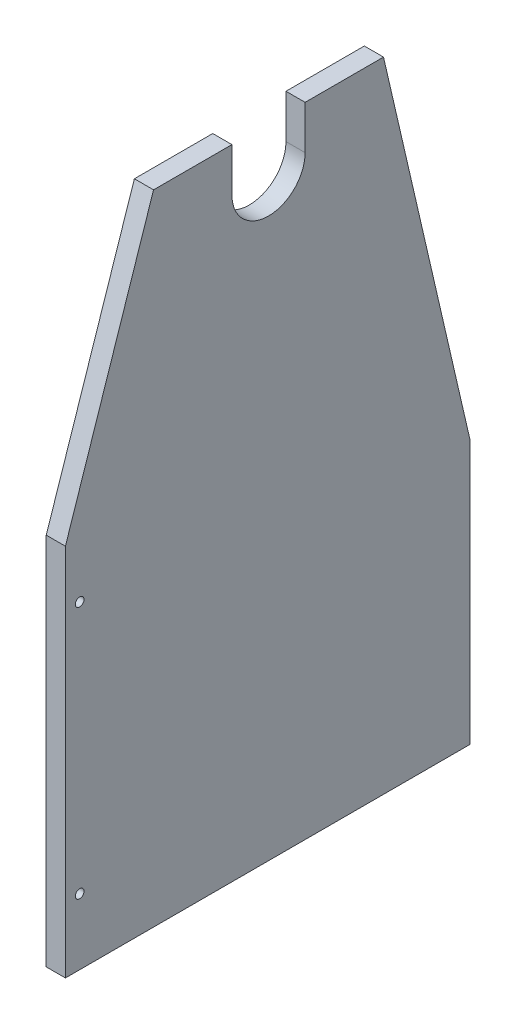
ISO-10303-21;
HEADER;
FILE_DESCRIPTION(('STEP AP214'),'2;1');
FILE_NAME('part.step','',(''),(''),'','','');
FILE_SCHEMA(('AUTOMOTIVE_DESIGN { 1 0 10303 214 1 1 1 1 }'));
ENDSEC;
DATA;
#1=APPLICATION_CONTEXT('core data for automotive mechanical design processes');
#2=APPLICATION_PROTOCOL_DEFINITION('international standard','automotive_design',2000,#1);
#3=PRODUCT_CONTEXT('',#1,'mechanical');
#4=PRODUCT('Part','Part','',(#3));
#5=PRODUCT_RELATED_PRODUCT_CATEGORY('part','',(#4));
#6=PRODUCT_DEFINITION_FORMATION('','',#4);
#7=PRODUCT_DEFINITION_CONTEXT('part definition',#1,'design');
#8=PRODUCT_DEFINITION('design','',#6,#7);
#9=PRODUCT_DEFINITION_SHAPE('','',#8);
#10=(LENGTH_UNIT() NAMED_UNIT(*) SI_UNIT(.MILLI.,.METRE.));
#11=(NAMED_UNIT(*) PLANE_ANGLE_UNIT() SI_UNIT($,.RADIAN.));
#12=(NAMED_UNIT(*) SI_UNIT($,.STERADIAN.) SOLID_ANGLE_UNIT());
#13=UNCERTAINTY_MEASURE_WITH_UNIT(LENGTH_MEASURE(1.E-05),#10,'distance_accuracy_value','');
#14=(GEOMETRIC_REPRESENTATION_CONTEXT(3) GLOBAL_UNCERTAINTY_ASSIGNED_CONTEXT((#13)) GLOBAL_UNIT_ASSIGNED_CONTEXT((#10,
#11,#12)) REPRESENTATION_CONTEXT('',''));
#15=CARTESIAN_POINT('',(0.,0.,0.));
#16=DIRECTION('',(0.,0.,1.));
#17=DIRECTION('',(1.,0.,0.));
#18=AXIS2_PLACEMENT_3D('',#15,#16,#17);
#19=CARTESIAN_POINT('',(17.4625,581.598745126243,-80.2642673699791));
#20=DIRECTION('',(0.,-1.,0.));
#21=DIRECTION('',(0.,0.,-1.));
#22=AXIS2_PLACEMENT_3D('',#19,#20,#21);
#23=PLANE('',#22);
#24=DIRECTION('',(1.,0.,0.));
#25=VECTOR('',#24,1.);
#26=CARTESIAN_POINT('',(-98.8848130402237,581.598745126243,-151.662555820192));
#27=LINE('',#26,#25);
#28=CARTESIAN_POINT('',(0.,581.598745126243,-151.662555820192));
#29=VERTEX_POINT('',#28);
#30=CARTESIAN_POINT('',(17.4625,581.598745126243,-151.662555820192));
#31=VERTEX_POINT('',#30);
#32=EDGE_CURVE('E199',#29,#31,#27,.T.);
#33=ORIENTED_EDGE('',*,*,#32,.F.);
#34=DIRECTION('',(0.,0.,1.));
#35=VECTOR('',#34,1.);
#36=CARTESIAN_POINT('',(0.,581.598745126243,-80.2642673699791));
#37=LINE('',#36,#35);
#38=CARTESIAN_POINT('',(0.,581.598745126243,-80.2642673699791));
#39=VERTEX_POINT('',#38);
#40=EDGE_CURVE('E147',#29,#39,#37,.T.);
#41=ORIENTED_EDGE('',*,*,#40,.T.);
#42=DIRECTION('',(-1.,0.,0.));
#43=VECTOR('',#42,1.);
#44=CARTESIAN_POINT('',(17.4625,581.598745126243,-80.2642673699791));
#45=LINE('',#44,#43);
#46=CARTESIAN_POINT('',(17.4625,581.598745126243,-80.2642673699791));
#47=VERTEX_POINT('',#46);
#48=EDGE_CURVE('E128',#47,#39,#45,.T.);
#49=ORIENTED_EDGE('',*,*,#48,.F.);
#50=DIRECTION('',(0.,0.,1.));
#51=VECTOR('',#50,1.);
#52=CARTESIAN_POINT('',(17.4625,581.598745126243,-80.2642673699791));
#53=LINE('',#52,#51);
#54=EDGE_CURVE('E118',#31,#47,#53,.T.);
#55=ORIENTED_EDGE('',*,*,#54,.F.);
#56=EDGE_LOOP('',(#33,#41,#49,#55));
#57=FACE_BOUND('',#56,.T.);
#58=ADVANCED_FACE('F36',(#57),#23,.F.);
#59=CARTESIAN_POINT('',(17.4625,340.614,0.));
#60=DIRECTION('',(0.,0.,-1.));
#61=DIRECTION('',(0.,1.,0.));
#62=AXIS2_PLACEMENT_3D('',#59,#60,#61);
#63=PLANE('',#62);
#64=DIRECTION('',(0.,-1.,0.));
#65=VECTOR('',#64,1.);
#66=CARTESIAN_POINT('',(0.,340.614,0.));
#67=LINE('',#66,#65);
#68=CARTESIAN_POINT('',(0.,340.614,0.));
#69=VERTEX_POINT('',#68);
#70=CARTESIAN_POINT('',(0.,0.,0.));
#71=VERTEX_POINT('',#70);
#72=EDGE_CURVE('E143',#69,#71,#67,.T.);
#73=ORIENTED_EDGE('',*,*,#72,.T.);
#74=DIRECTION('',(-1.,0.,0.));
#75=VECTOR('',#74,1.);
#76=CARTESIAN_POINT('',(17.4625,0.,0.));
#77=LINE('',#76,#75);
#78=CARTESIAN_POINT('',(17.4625,0.,0.));
#79=VERTEX_POINT('',#78);
#80=EDGE_CURVE('E11',#79,#71,#77,.T.);
#81=ORIENTED_EDGE('',*,*,#80,.F.);
#82=DIRECTION('',(0.,-1.,0.));
#83=VECTOR('',#82,1.);
#84=CARTESIAN_POINT('',(17.4625,340.614,0.));
#85=LINE('',#84,#83);
#86=CARTESIAN_POINT('',(17.4625,340.614,0.));
#87=VERTEX_POINT('',#86);
#88=EDGE_CURVE('E152',#87,#79,#85,.T.);
#89=ORIENTED_EDGE('',*,*,#88,.F.);
#90=DIRECTION('',(-1.,0.,0.));
#91=VECTOR('',#90,1.);
#92=CARTESIAN_POINT('',(17.4625,340.614,0.));
#93=LINE('',#92,#91);
#94=EDGE_CURVE('E140',#87,#69,#93,.T.);
#95=ORIENTED_EDGE('',*,*,#94,.T.);
#96=EDGE_LOOP('',(#73,#81,#89,#95));
#97=FACE_BOUND('',#96,.T.);
#98=ADVANCED_FACE('F37',(#97),#63,.F.);
#99=CARTESIAN_POINT('',(17.4625,0.,0.));
#100=DIRECTION('',(0.,1.,0.));
#101=DIRECTION('',(0.,0.,1.));
#102=AXIS2_PLACEMENT_3D('',#99,#100,#101);
#103=PLANE('',#102);
#104=DIRECTION('',(0.,0.,-1.));
#105=VECTOR('',#104,1.);
#106=CARTESIAN_POINT('',(0.,0.,0.));
#107=LINE('',#106,#105);
#108=CARTESIAN_POINT('',(0.,0.,-368.3));
#109=VERTEX_POINT('',#108);
#110=EDGE_CURVE('E145',#71,#109,#107,.T.);
#111=ORIENTED_EDGE('',*,*,#110,.T.);
#112=DIRECTION('',(-1.,0.,0.));
#113=VECTOR('',#112,1.);
#114=CARTESIAN_POINT('',(17.4625,0.,-368.3));
#115=LINE('',#114,#113);
#116=CARTESIAN_POINT('',(17.4625,0.,-368.3));
#117=VERTEX_POINT('',#116);
#118=EDGE_CURVE('E46',#117,#109,#115,.T.);
#119=ORIENTED_EDGE('',*,*,#118,.F.);
#120=DIRECTION('',(0.,0.,-1.));
#121=VECTOR('',#120,1.);
#122=CARTESIAN_POINT('',(17.4625,0.,0.));
#123=LINE('',#122,#121);
#124=EDGE_CURVE('E100',#79,#117,#123,.T.);
#125=ORIENTED_EDGE('',*,*,#124,.F.);
#126=ORIENTED_EDGE('',*,*,#80,.T.);
#127=EDGE_LOOP('',(#111,#119,#125,#126));
#128=FACE_BOUND('',#127,.T.);
#129=ADVANCED_FACE('F207',(#128),#103,.F.);
#130=CARTESIAN_POINT('',(17.4625,0.,-368.3));
#131=DIRECTION('',(0.,0.,1.));
#132=DIRECTION('',(1.,0.,0.));
#133=AXIS2_PLACEMENT_3D('',#130,#131,#132);
#134=PLANE('',#133);
#135=DIRECTION('',(0.,1.,0.));
#136=VECTOR('',#135,1.);
#137=CARTESIAN_POINT('',(0.,0.,-368.3));
#138=LINE('',#137,#136);
#139=CARTESIAN_POINT('',(0.,241.3,-368.3));
#140=VERTEX_POINT('',#139);
#141=EDGE_CURVE('E150',#109,#140,#138,.T.);
#142=ORIENTED_EDGE('',*,*,#141,.T.);
#143=DIRECTION('',(-1.,0.,0.));
#144=VECTOR('',#143,1.);
#145=CARTESIAN_POINT('',(17.4625,241.3,-368.3));
#146=LINE('',#145,#144);
#147=CARTESIAN_POINT('',(17.4625,241.3,-368.3));
#148=VERTEX_POINT('',#147);
#149=EDGE_CURVE('E129',#148,#140,#146,.T.);
#150=ORIENTED_EDGE('',*,*,#149,.F.);
#151=DIRECTION('',(0.,1.,0.));
#152=VECTOR('',#151,1.);
#153=CARTESIAN_POINT('',(17.4625,0.,-368.3));
#154=LINE('',#153,#152);
#155=EDGE_CURVE('E113',#117,#148,#154,.T.);
#156=ORIENTED_EDGE('',*,*,#155,.F.);
#157=ORIENTED_EDGE('',*,*,#118,.T.);
#158=EDGE_LOOP('',(#142,#150,#156,#157));
#159=FACE_BOUND('',#158,.T.);
#160=ADVANCED_FACE('F159',(#159),#134,.F.);
#161=CARTESIAN_POINT('',(17.4625,241.3,-368.3));
#162=DIRECTION('',(0.,-0.224951054343865,0.974370064785235));
#163=DIRECTION('',(0.,-0.974370064785235,-0.224951054343865));
#164=AXIS2_PLACEMENT_3D('',#161,#162,#163);
#165=PLANE('',#164);
#166=DIRECTION('',(0.,0.974370064785235,0.224951054343865));
#167=VECTOR('',#166,1.);
#168=CARTESIAN_POINT('',(0.,241.3,-368.3));
#169=LINE('',#168,#167);
#170=CARTESIAN_POINT('',(0.,581.598745126243,-289.735844270405));
#171=VERTEX_POINT('',#170);
#172=EDGE_CURVE('E121',#140,#171,#169,.T.);
#173=ORIENTED_EDGE('',*,*,#172,.T.);
#174=DIRECTION('',(-1.,0.,0.));
#175=VECTOR('',#174,1.);
#176=CARTESIAN_POINT('',(17.4625,581.598745126243,-289.735844270405));
#177=LINE('',#176,#175);
#178=CARTESIAN_POINT('',(17.4625,581.598745126243,-289.735844270405));
#179=VERTEX_POINT('',#178);
#180=EDGE_CURVE('E124',#179,#171,#177,.T.);
#181=ORIENTED_EDGE('',*,*,#180,.F.);
#182=DIRECTION('',(0.,0.974370064785235,0.224951054343865));
#183=VECTOR('',#182,1.);
#184=CARTESIAN_POINT('',(17.4625,241.3,-368.3));
#185=LINE('',#184,#183);
#186=EDGE_CURVE('E110',#148,#179,#185,.T.);
#187=ORIENTED_EDGE('',*,*,#186,.F.);
#188=ORIENTED_EDGE('',*,*,#149,.T.);
#189=EDGE_LOOP('',(#173,#181,#187,#188));
#190=FACE_BOUND('',#189,.T.);
#191=ADVANCED_FACE('F122',(#190),#165,.F.);
#192=CARTESIAN_POINT('',(0.,581.598745126243,-218.337555820192));
#193=VERTEX_POINT('',#192);
#194=EDGE_CURVE('E151',#171,#193,#37,.T.);
#195=ORIENTED_EDGE('',*,*,#194,.T.);
#196=DIRECTION('',(1.,0.,0.));
#197=VECTOR('',#196,1.);
#198=CARTESIAN_POINT('',(-98.8848130402237,581.598745126243,-218.337555820192));
#199=LINE('',#198,#197);
#200=CARTESIAN_POINT('',(17.4625,581.598745126243,-218.337555820192));
#201=VERTEX_POINT('',#200);
#202=EDGE_CURVE('E132',#193,#201,#199,.T.);
#203=ORIENTED_EDGE('',*,*,#202,.T.);
#204=EDGE_CURVE('E114',#179,#201,#53,.T.);
#205=ORIENTED_EDGE('',*,*,#204,.F.);
#206=ORIENTED_EDGE('',*,*,#180,.T.);
#207=EDGE_LOOP('',(#195,#203,#205,#206));
#208=FACE_BOUND('',#207,.T.);
#209=ADVANCED_FACE('F135',(#208),#23,.F.);
#210=CARTESIAN_POINT('',(17.4625,581.598745126243,-80.2642673699791));
#211=DIRECTION('',(0.,-0.316001052637713,-0.948758839079699));
#212=DIRECTION('',(0.,0.948758839079699,-0.316001052637713));
#213=AXIS2_PLACEMENT_3D('',#210,#211,#212);
#214=PLANE('',#213);
#215=DIRECTION('',(0.,-0.948758839079698,0.316001052637713));
#216=VECTOR('',#215,1.);
#217=CARTESIAN_POINT('',(0.,581.598745126243,-80.2642673699791));
#218=LINE('',#217,#216);
#219=EDGE_CURVE('E90',#39,#69,#218,.T.);
#220=ORIENTED_EDGE('',*,*,#219,.T.);
#221=ORIENTED_EDGE('',*,*,#94,.F.);
#222=DIRECTION('',(0.,-0.948758839079698,0.316001052637713));
#223=VECTOR('',#222,1.);
#224=CARTESIAN_POINT('',(17.4625,581.598745126243,-80.2642673699791));
#225=LINE('',#224,#223);
#226=EDGE_CURVE('E61',#47,#87,#225,.T.);
#227=ORIENTED_EDGE('',*,*,#226,.F.);
#228=ORIENTED_EDGE('',*,*,#48,.T.);
#229=EDGE_LOOP('',(#220,#221,#227,#228));
#230=FACE_BOUND('',#229,.T.);
#231=ADVANCED_FACE('F229',(#230),#214,.F.);
#232=CARTESIAN_POINT('',(17.4625,0.,0.));
#233=DIRECTION('',(1.,0.,0.));
#234=DIRECTION('',(0.,0.,-1.));
#235=AXIS2_PLACEMENT_3D('',#232,#233,#234);
#236=PLANE('',#235);
#237=CARTESIAN_POINT('',(17.4625,60.,-13.));
#238=DIRECTION('',(1.,0.,0.));
#239=DIRECTION('',(0.,0.,-1.));
#240=AXIS2_PLACEMENT_3D('',#237,#238,#239);
#241=CIRCLE('',#240,3.96875);
#242=CARTESIAN_POINT('',(17.4625,60.,-9.03125));
#243=VERTEX_POINT('',#242);
#244=EDGE_CURVE('E195',#243,#243,#241,.F.);
#245=ORIENTED_EDGE('',*,*,#244,.T.);
#246=EDGE_LOOP('',(#245));
#247=FACE_BOUND('',#246,.T.);
#248=CARTESIAN_POINT('',(17.4625,290.1875,-13.));
#249=DIRECTION('',(1.,0.,0.));
#250=DIRECTION('',(0.,0.,-1.));
#251=AXIS2_PLACEMENT_3D('',#248,#249,#250);
#252=CIRCLE('',#251,3.96875000000002);
#253=CARTESIAN_POINT('',(17.4625,290.1875,-9.03124999999998));
#254=VERTEX_POINT('',#253);
#255=EDGE_CURVE('E322',#254,#254,#252,.F.);
#256=ORIENTED_EDGE('',*,*,#255,.T.);
#257=EDGE_LOOP('',(#256));
#258=FACE_BOUND('',#257,.T.);
#259=DIRECTION('',(0.,1.,0.));
#260=VECTOR('',#259,1.);
#261=CARTESIAN_POINT('',(17.4625,0.,-218.337555820192));
#262=LINE('',#261,#260);
#263=CARTESIAN_POINT('',(17.4625,541.911245126243,-218.337555820192));
#264=VERTEX_POINT('',#263);
#265=EDGE_CURVE('E185',#264,#201,#262,.T.);
#266=ORIENTED_EDGE('',*,*,#265,.F.);
#267=CARTESIAN_POINT('',(17.4625,541.911245126243,-185.000055820192));
#268=DIRECTION('',(1.,0.,0.));
#269=DIRECTION('',(0.,0.,-1.));
#270=AXIS2_PLACEMENT_3D('',#267,#268,#269);
#271=CIRCLE('',#270,33.3375);
#272=CARTESIAN_POINT('',(17.4625,541.911245126243,-151.662555820192));
#273=VERTEX_POINT('',#272);
#274=EDGE_CURVE('E189',#273,#264,#271,.T.);
#275=ORIENTED_EDGE('',*,*,#274,.F.);
#276=DIRECTION('',(0.,1.,0.));
#277=VECTOR('',#276,1.);
#278=CARTESIAN_POINT('',(17.4625,0.,-151.662555820192));
#279=LINE('',#278,#277);
#280=EDGE_CURVE('E181',#273,#31,#279,.T.);
#281=ORIENTED_EDGE('',*,*,#280,.T.);
#282=ORIENTED_EDGE('',*,*,#54,.T.);
#283=ORIENTED_EDGE('',*,*,#226,.T.);
#284=ORIENTED_EDGE('',*,*,#88,.T.);
#285=ORIENTED_EDGE('',*,*,#124,.T.);
#286=ORIENTED_EDGE('',*,*,#155,.T.);
#287=ORIENTED_EDGE('',*,*,#186,.T.);
#288=ORIENTED_EDGE('',*,*,#204,.T.);
#289=EDGE_LOOP('',(#266,#275,#281,#282,#283,#284,#285,#286,#287,#288));
#290=FACE_BOUND('',#289,.T.);
#291=ADVANCED_FACE('F109',(#247,#258,#290),#236,.T.);
#292=CARTESIAN_POINT('',(0.,0.,0.));
#293=DIRECTION('',(1.,0.,0.));
#294=DIRECTION('',(0.,0.,-1.));
#295=AXIS2_PLACEMENT_3D('',#292,#293,#294);
#296=PLANE('',#295);
#297=CARTESIAN_POINT('',(0.,60.,-13.));
#298=DIRECTION('',(-1.,0.,0.));
#299=DIRECTION('',(0.,0.,1.));
#300=AXIS2_PLACEMENT_3D('',#297,#298,#299);
#301=CIRCLE('',#300,3.96875);
#302=CARTESIAN_POINT('',(0.,60.,-9.03125));
#303=VERTEX_POINT('',#302);
#304=EDGE_CURVE('E320',#303,#303,#301,.T.);
#305=ORIENTED_EDGE('',*,*,#304,.F.);
#306=EDGE_LOOP('',(#305));
#307=FACE_BOUND('',#306,.T.);
#308=CARTESIAN_POINT('',(0.,290.1875,-13.));
#309=DIRECTION('',(-1.,0.,0.));
#310=DIRECTION('',(0.,0.,1.));
#311=AXIS2_PLACEMENT_3D('',#308,#309,#310);
#312=CIRCLE('',#311,3.96875000000002);
#313=CARTESIAN_POINT('',(0.,290.1875,-9.03124999999998));
#314=VERTEX_POINT('',#313);
#315=EDGE_CURVE('E321',#314,#314,#312,.T.);
#316=ORIENTED_EDGE('',*,*,#315,.F.);
#317=EDGE_LOOP('',(#316));
#318=FACE_BOUND('',#317,.T.);
#319=ORIENTED_EDGE('',*,*,#40,.F.);
#320=DIRECTION('',(0.,-1.,0.));
#321=VECTOR('',#320,1.);
#322=CARTESIAN_POINT('',(0.,0.,-151.662555820192));
#323=LINE('',#322,#321);
#324=CARTESIAN_POINT('',(0.,541.911245126243,-151.662555820192));
#325=VERTEX_POINT('',#324);
#326=EDGE_CURVE('E200',#29,#325,#323,.T.);
#327=ORIENTED_EDGE('',*,*,#326,.T.);
#328=CARTESIAN_POINT('',(0.,541.911245126243,-185.000055820192));
#329=DIRECTION('',(1.,0.,0.));
#330=DIRECTION('',(0.,0.,-1.));
#331=AXIS2_PLACEMENT_3D('',#328,#329,#330);
#332=CIRCLE('',#331,33.3375);
#333=CARTESIAN_POINT('',(0.,541.911245126243,-218.337555820192));
#334=VERTEX_POINT('',#333);
#335=EDGE_CURVE('E204',#334,#325,#332,.F.);
#336=ORIENTED_EDGE('',*,*,#335,.F.);
#337=DIRECTION('',(0.,-1.,0.));
#338=VECTOR('',#337,1.);
#339=CARTESIAN_POINT('',(0.,0.,-218.337555820192));
#340=LINE('',#339,#338);
#341=EDGE_CURVE('E144',#193,#334,#340,.T.);
#342=ORIENTED_EDGE('',*,*,#341,.F.);
#343=ORIENTED_EDGE('',*,*,#194,.F.);
#344=ORIENTED_EDGE('',*,*,#172,.F.);
#345=ORIENTED_EDGE('',*,*,#141,.F.);
#346=ORIENTED_EDGE('',*,*,#110,.F.);
#347=ORIENTED_EDGE('',*,*,#72,.F.);
#348=ORIENTED_EDGE('',*,*,#219,.F.);
#349=EDGE_LOOP('',(#319,#327,#336,#342,#343,#344,#345,#346,#347,#348));
#350=FACE_BOUND('',#349,.T.);
#351=ADVANCED_FACE('F162',(#307,#318,#350),#296,.F.);
#352=CARTESIAN_POINT('',(-98.8848130402237,541.911245126243,-185.000055820192));
#353=DIRECTION('',(1.,0.,0.));
#354=DIRECTION('',(0.,0.,-1.));
#355=AXIS2_PLACEMENT_3D('',#352,#353,#354);
#356=CYLINDRICAL_SURFACE('',#355,33.3375);
#357=ORIENTED_EDGE('',*,*,#335,.T.);
#358=DIRECTION('',(1.,0.,0.));
#359=VECTOR('',#358,1.);
#360=CARTESIAN_POINT('',(-98.8848130402237,541.911245126243,-151.662555820192));
#361=LINE('',#360,#359);
#362=EDGE_CURVE('E188',#325,#273,#361,.T.);
#363=ORIENTED_EDGE('',*,*,#362,.T.);
#364=ORIENTED_EDGE('',*,*,#274,.T.);
#365=DIRECTION('',(1.,0.,0.));
#366=VECTOR('',#365,1.);
#367=CARTESIAN_POINT('',(-98.8848130402237,541.911245126243,-218.337555820192));
#368=LINE('',#367,#366);
#369=EDGE_CURVE('E52',#334,#264,#368,.T.);
#370=ORIENTED_EDGE('',*,*,#369,.F.);
#371=EDGE_LOOP('',(#357,#363,#364,#370));
#372=FACE_BOUND('',#371,.T.);
#373=ADVANCED_FACE('F186',(#372),#356,.F.);
#374=CARTESIAN_POINT('',(-98.8848130402237,0.,-151.662555820192));
#375=DIRECTION('',(0.,0.,-1.));
#376=DIRECTION('',(-1.,0.,0.));
#377=AXIS2_PLACEMENT_3D('',#374,#375,#376);
#378=PLANE('',#377);
#379=ORIENTED_EDGE('',*,*,#32,.T.);
#380=ORIENTED_EDGE('',*,*,#280,.F.);
#381=ORIENTED_EDGE('',*,*,#362,.F.);
#382=ORIENTED_EDGE('',*,*,#326,.F.);
#383=EDGE_LOOP('',(#379,#380,#381,#382));
#384=FACE_BOUND('',#383,.T.);
#385=ADVANCED_FACE('F277',(#384),#378,.T.);
#386=CARTESIAN_POINT('',(-98.8848130402237,0.,-218.337555820192));
#387=DIRECTION('',(0.,0.,-1.));
#388=DIRECTION('',(-1.,0.,0.));
#389=AXIS2_PLACEMENT_3D('',#386,#387,#388);
#390=PLANE('',#389);
#391=ORIENTED_EDGE('',*,*,#341,.T.);
#392=ORIENTED_EDGE('',*,*,#369,.T.);
#393=ORIENTED_EDGE('',*,*,#265,.T.);
#394=ORIENTED_EDGE('',*,*,#202,.F.);
#395=EDGE_LOOP('',(#391,#392,#393,#394));
#396=FACE_BOUND('',#395,.T.);
#397=ADVANCED_FACE('F182',(#396),#390,.F.);
#398=CARTESIAN_POINT('',(28.6878201513365,290.1875,-13.));
#399=DIRECTION('',(-1.,0.,0.));
#400=DIRECTION('',(0.,0.,1.));
#401=AXIS2_PLACEMENT_3D('',#398,#399,#400);
#402=CYLINDRICAL_SURFACE('',#401,3.96875000000002);
#403=CARTESIAN_POINT('',(0.,290.1875,-9.03124999999998));
#404=CARTESIAN_POINT('',(0.181901041666671,290.1875,-9.03124999999998));
#405=CARTESIAN_POINT('',(0.363802083333338,290.1875,-9.03124999999998));
#406=CARTESIAN_POINT('',(0.727604166666671,290.1875,-9.03124999999998));
#407=CARTESIAN_POINT('',(0.909505208333337,290.1875,-9.03124999999998));
#408=CARTESIAN_POINT('',(1.27330729166667,290.1875,-9.03124999999998));
#409=CARTESIAN_POINT('',(1.45520833333334,290.1875,-9.03124999999998));
#410=CARTESIAN_POINT('',(1.81901041666667,290.1875,-9.03124999999998));
#411=CARTESIAN_POINT('',(2.00091145833334,290.1875,-9.03124999999998));
#412=CARTESIAN_POINT('',(2.36471354166667,290.1875,-9.03124999999998));
#413=CARTESIAN_POINT('',(2.54661458333334,290.1875,-9.03124999999998));
#414=CARTESIAN_POINT('',(2.91041666666667,290.1875,-9.03124999999998));
#415=CARTESIAN_POINT('',(3.09231770833334,290.1875,-9.03124999999998));
#416=CARTESIAN_POINT('',(3.45611979166667,290.1875,-9.03124999999998));
#417=CARTESIAN_POINT('',(3.63802083333334,290.1875,-9.03124999999998));
#418=CARTESIAN_POINT('',(4.00182291666667,290.1875,-9.03124999999998));
#419=CARTESIAN_POINT('',(4.18372395833334,290.1875,-9.03124999999998));
#420=CARTESIAN_POINT('',(4.54752604166667,290.1875,-9.03124999999998));
#421=CARTESIAN_POINT('',(4.72942708333334,290.1875,-9.03124999999998));
#422=CARTESIAN_POINT('',(5.09322916666667,290.1875,-9.03124999999998));
#423=CARTESIAN_POINT('',(5.27513020833334,290.1875,-9.03124999999998));
#424=CARTESIAN_POINT('',(5.63893229166667,290.1875,-9.03124999999998));
#425=CARTESIAN_POINT('',(5.82083333333333,290.1875,-9.03124999999998));
#426=CARTESIAN_POINT('',(6.18463541666667,290.1875,-9.03124999999998));
#427=CARTESIAN_POINT('',(6.36653645833333,290.1875,-9.03124999999998));
#428=CARTESIAN_POINT('',(6.73033854166667,290.1875,-9.03124999999998));
#429=CARTESIAN_POINT('',(6.91223958333333,290.1875,-9.03124999999998));
#430=CARTESIAN_POINT('',(7.27604166666667,290.1875,-9.03124999999998));
#431=CARTESIAN_POINT('',(7.45794270833334,290.1875,-9.03124999999998));
#432=CARTESIAN_POINT('',(7.82174479166667,290.1875,-9.03124999999998));
#433=CARTESIAN_POINT('',(8.00364583333334,290.1875,-9.03124999999998));
#434=CARTESIAN_POINT('',(8.36744791666667,290.1875,-9.03124999999998));
#435=CARTESIAN_POINT('',(8.54934895833333,290.1875,-9.03124999999998));
#436=CARTESIAN_POINT('',(8.91315104166667,290.1875,-9.03124999999998));
#437=CARTESIAN_POINT('',(9.09505208333333,290.1875,-9.03124999999998));
#438=CARTESIAN_POINT('',(9.45885416666667,290.1875,-9.03124999999998));
#439=CARTESIAN_POINT('',(9.64075520833333,290.1875,-9.03124999999998));
#440=CARTESIAN_POINT('',(10.0045572916667,290.1875,-9.03124999999998));
#441=CARTESIAN_POINT('',(10.1864583333333,290.1875,-9.03124999999998));
#442=CARTESIAN_POINT('',(10.5502604166667,290.1875,-9.03124999999998));
#443=CARTESIAN_POINT('',(10.7321614583333,290.1875,-9.03124999999998));
#444=CARTESIAN_POINT('',(11.0959635416667,290.1875,-9.03124999999998));
#445=CARTESIAN_POINT('',(11.2778645833333,290.1875,-9.03124999999998));
#446=CARTESIAN_POINT('',(11.6416666666667,290.1875,-9.03124999999998));
#447=CARTESIAN_POINT('',(11.8235677083333,290.1875,-9.03124999999998));
#448=CARTESIAN_POINT('',(12.1873697916667,290.1875,-9.03124999999998));
#449=CARTESIAN_POINT('',(12.3692708333333,290.1875,-9.03124999999998));
#450=CARTESIAN_POINT('',(12.7330729166667,290.1875,-9.03124999999998));
#451=CARTESIAN_POINT('',(12.9149739583333,290.1875,-9.03124999999998));
#452=CARTESIAN_POINT('',(13.2787760416667,290.1875,-9.03124999999998));
#453=CARTESIAN_POINT('',(13.4606770833333,290.1875,-9.03124999999998));
#454=CARTESIAN_POINT('',(13.8244791666667,290.1875,-9.03124999999998));
#455=CARTESIAN_POINT('',(14.0063802083333,290.1875,-9.03124999999998));
#456=CARTESIAN_POINT('',(14.3701822916667,290.1875,-9.03124999999998));
#457=CARTESIAN_POINT('',(14.5520833333333,290.1875,-9.03124999999998));
#458=CARTESIAN_POINT('',(14.9158854166667,290.1875,-9.03124999999998));
#459=CARTESIAN_POINT('',(15.0977864583333,290.1875,-9.03124999999998));
#460=CARTESIAN_POINT('',(15.4615885416667,290.1875,-9.03124999999998));
#461=CARTESIAN_POINT('',(15.6434895833333,290.1875,-9.03124999999998));
#462=CARTESIAN_POINT('',(16.0072916666667,290.1875,-9.03124999999998));
#463=CARTESIAN_POINT('',(16.1891927083333,290.1875,-9.03124999999998));
#464=CARTESIAN_POINT('',(16.5529947916667,290.1875,-9.03124999999998));
#465=CARTESIAN_POINT('',(16.7348958333333,290.1875,-9.03124999999998));
#466=CARTESIAN_POINT('',(17.0986979166667,290.1875,-9.03124999999998));
#467=CARTESIAN_POINT('',(17.2805989583333,290.1875,-9.03124999999998));
#468=CARTESIAN_POINT('',(17.4625,290.1875,-9.03124999999998));
#469=B_SPLINE_CURVE_WITH_KNOTS('',3,(#403,#404,#405,#406,#407,#408,#409,#410,#411,#412,#413,
#414,#415,#416,#417,#418,#419,#420,#421,#422,#423,#424,#425,#426,#427,#428,#429,#430,#431,#432,
#433,#434,#435,#436,#437,#438,#439,#440,#441,#442,#443,#444,#445,#446,#447,#448,#449,#450,#451,
#452,#453,#454,#455,#456,#457,#458,#459,#460,#461,#462,#463,#464,#465,#466,#467,#468),
.UNSPECIFIED.,.F.,.F.,(4,2,2,2,2,2,2,2,2,2,2,2,2,2,2,2,2,2,2,2,2,2,2,2,2,2,2,2,2,2,2,2,4),(0.,
0.545703125000002,1.09140625,1.637109375,2.1828125,2.728515625,3.27421875,3.819921875,4.365625,
4.911328125,5.45703125,6.002734375,6.5484375,7.094140625,7.63984375,8.185546875,8.73125,
9.276953125,9.82265625,10.368359375,10.9140625,11.459765625,12.00546875,12.551171875,13.096875,
13.642578125,14.18828125,14.733984375,15.2796875,15.825390625,16.37109375,16.916796875,17.4625),.UNSPECIFIED.);
#470=EDGE_CURVE('BSEAM291',#314,#254,#469,.T.);
#471=ORIENTED_EDGE('',*,*,#315,.T.);
#472=ORIENTED_EDGE('',*,*,#255,.F.);
#473=ORIENTED_EDGE('',*,*,#470,.T.);
#474=ORIENTED_EDGE('',*,*,#470,.F.);
#475=EDGE_LOOP('',(#471,#473,#472,#474));
#476=FACE_BOUND('',#475,.T.);
#477=ADVANCED_FACE('F291',(#476),#402,.F.);
#478=CARTESIAN_POINT('',(28.6878201513365,60.,-13.));
#479=DIRECTION('',(-1.,0.,0.));
#480=DIRECTION('',(0.,0.,1.));
#481=AXIS2_PLACEMENT_3D('',#478,#479,#480);
#482=CYLINDRICAL_SURFACE('',#481,3.96875);
#483=CARTESIAN_POINT('',(0.,60.,-9.03125));
#484=CARTESIAN_POINT('',(0.181901041666671,60.,-9.03125));
#485=CARTESIAN_POINT('',(0.363802083333338,60.,-9.03125));
#486=CARTESIAN_POINT('',(0.727604166666671,60.,-9.03125));
#487=CARTESIAN_POINT('',(0.909505208333337,60.,-9.03125));
#488=CARTESIAN_POINT('',(1.27330729166667,60.,-9.03125));
#489=CARTESIAN_POINT('',(1.45520833333334,60.,-9.03125));
#490=CARTESIAN_POINT('',(1.81901041666667,60.,-9.03125));
#491=CARTESIAN_POINT('',(2.00091145833334,60.,-9.03125));
#492=CARTESIAN_POINT('',(2.36471354166667,60.,-9.03125));
#493=CARTESIAN_POINT('',(2.54661458333334,60.,-9.03125));
#494=CARTESIAN_POINT('',(2.91041666666667,60.,-9.03125));
#495=CARTESIAN_POINT('',(3.09231770833334,60.,-9.03125));
#496=CARTESIAN_POINT('',(3.45611979166667,60.,-9.03125));
#497=CARTESIAN_POINT('',(3.63802083333334,60.,-9.03125));
#498=CARTESIAN_POINT('',(4.00182291666667,60.,-9.03125));
#499=CARTESIAN_POINT('',(4.18372395833334,60.,-9.03125));
#500=CARTESIAN_POINT('',(4.54752604166667,60.,-9.03125));
#501=CARTESIAN_POINT('',(4.72942708333334,60.,-9.03125));
#502=CARTESIAN_POINT('',(5.09322916666667,60.,-9.03125));
#503=CARTESIAN_POINT('',(5.27513020833334,60.,-9.03125));
#504=CARTESIAN_POINT('',(5.63893229166667,60.,-9.03125));
#505=CARTESIAN_POINT('',(5.82083333333333,60.,-9.03125));
#506=CARTESIAN_POINT('',(6.18463541666667,60.,-9.03125));
#507=CARTESIAN_POINT('',(6.36653645833333,60.,-9.03125));
#508=CARTESIAN_POINT('',(6.73033854166667,60.,-9.03125));
#509=CARTESIAN_POINT('',(6.91223958333333,60.,-9.03125));
#510=CARTESIAN_POINT('',(7.27604166666667,60.,-9.03125));
#511=CARTESIAN_POINT('',(7.45794270833334,60.,-9.03125));
#512=CARTESIAN_POINT('',(7.82174479166667,60.,-9.03125));
#513=CARTESIAN_POINT('',(8.00364583333334,60.,-9.03125));
#514=CARTESIAN_POINT('',(8.36744791666667,60.,-9.03125));
#515=CARTESIAN_POINT('',(8.54934895833333,60.,-9.03125));
#516=CARTESIAN_POINT('',(8.91315104166667,60.,-9.03125));
#517=CARTESIAN_POINT('',(9.09505208333333,60.,-9.03125));
#518=CARTESIAN_POINT('',(9.45885416666667,60.,-9.03125));
#519=CARTESIAN_POINT('',(9.64075520833333,60.,-9.03125));
#520=CARTESIAN_POINT('',(10.0045572916667,60.,-9.03125));
#521=CARTESIAN_POINT('',(10.1864583333333,60.,-9.03125));
#522=CARTESIAN_POINT('',(10.5502604166667,60.,-9.03125));
#523=CARTESIAN_POINT('',(10.7321614583333,60.,-9.03125));
#524=CARTESIAN_POINT('',(11.0959635416667,60.,-9.03125));
#525=CARTESIAN_POINT('',(11.2778645833333,60.,-9.03125));
#526=CARTESIAN_POINT('',(11.6416666666667,60.,-9.03125));
#527=CARTESIAN_POINT('',(11.8235677083333,60.,-9.03125));
#528=CARTESIAN_POINT('',(12.1873697916667,60.,-9.03125));
#529=CARTESIAN_POINT('',(12.3692708333333,60.,-9.03125));
#530=CARTESIAN_POINT('',(12.7330729166667,60.,-9.03125));
#531=CARTESIAN_POINT('',(12.9149739583333,60.,-9.03125));
#532=CARTESIAN_POINT('',(13.2787760416667,60.,-9.03125));
#533=CARTESIAN_POINT('',(13.4606770833333,60.,-9.03125));
#534=CARTESIAN_POINT('',(13.8244791666667,60.,-9.03125));
#535=CARTESIAN_POINT('',(14.0063802083333,60.,-9.03125));
#536=CARTESIAN_POINT('',(14.3701822916667,60.,-9.03125));
#537=CARTESIAN_POINT('',(14.5520833333333,60.,-9.03125));
#538=CARTESIAN_POINT('',(14.9158854166667,60.,-9.03125));
#539=CARTESIAN_POINT('',(15.0977864583333,60.,-9.03125));
#540=CARTESIAN_POINT('',(15.4615885416667,60.,-9.03125));
#541=CARTESIAN_POINT('',(15.6434895833333,60.,-9.03125));
#542=CARTESIAN_POINT('',(16.0072916666667,60.,-9.03125));
#543=CARTESIAN_POINT('',(16.1891927083333,60.,-9.03125));
#544=CARTESIAN_POINT('',(16.5529947916667,60.,-9.03125));
#545=CARTESIAN_POINT('',(16.7348958333333,60.,-9.03125));
#546=CARTESIAN_POINT('',(17.0986979166667,60.,-9.03125));
#547=CARTESIAN_POINT('',(17.2805989583333,60.,-9.03125));
#548=CARTESIAN_POINT('',(17.4625,60.,-9.03125));
#549=B_SPLINE_CURVE_WITH_KNOTS('',3,(#483,#484,#485,#486,#487,#488,#489,#490,#491,#492,#493,
#494,#495,#496,#497,#498,#499,#500,#501,#502,#503,#504,#505,#506,#507,#508,#509,#510,#511,#512,
#513,#514,#515,#516,#517,#518,#519,#520,#521,#522,#523,#524,#525,#526,#527,#528,#529,#530,#531,
#532,#533,#534,#535,#536,#537,#538,#539,#540,#541,#542,#543,#544,#545,#546,#547,#548),
.UNSPECIFIED.,.F.,.F.,(4,2,2,2,2,2,2,2,2,2,2,2,2,2,2,2,2,2,2,2,2,2,2,2,2,2,2,2,2,2,2,2,4),(0.,
0.545703125000002,1.09140625,1.637109375,2.1828125,2.728515625,3.27421875,3.819921875,4.365625,
4.911328125,5.45703125,6.002734375,6.5484375,7.094140625,7.63984375,8.185546875,8.73125,
9.276953125,9.82265625,10.368359375,10.9140625,11.459765625,12.00546875,12.551171875,13.096875,
13.642578125,14.18828125,14.733984375,15.2796875,15.825390625,16.37109375,16.916796875,17.4625),.UNSPECIFIED.);
#550=EDGE_CURVE('BSEAM301',#303,#243,#549,.T.);
#551=ORIENTED_EDGE('',*,*,#304,.T.);
#552=ORIENTED_EDGE('',*,*,#244,.F.);
#553=ORIENTED_EDGE('',*,*,#550,.T.);
#554=ORIENTED_EDGE('',*,*,#550,.F.);
#555=EDGE_LOOP('',(#551,#553,#552,#554));
#556=FACE_BOUND('',#555,.T.);
#557=ADVANCED_FACE('F301',(#556),#482,.F.);
#558=CLOSED_SHELL('',(#58,#98,#129,#160,#191,#209,#231,#291,#351,#373,#385,#397,#477,#557));
#559=MANIFOLD_SOLID_BREP('B2',#558);
#560=ADVANCED_BREP_SHAPE_REPRESENTATION('',(#18,#559),#14);
#561=SHAPE_DEFINITION_REPRESENTATION(#9,#560);
ENDSEC;
END-ISO-10303-21;
